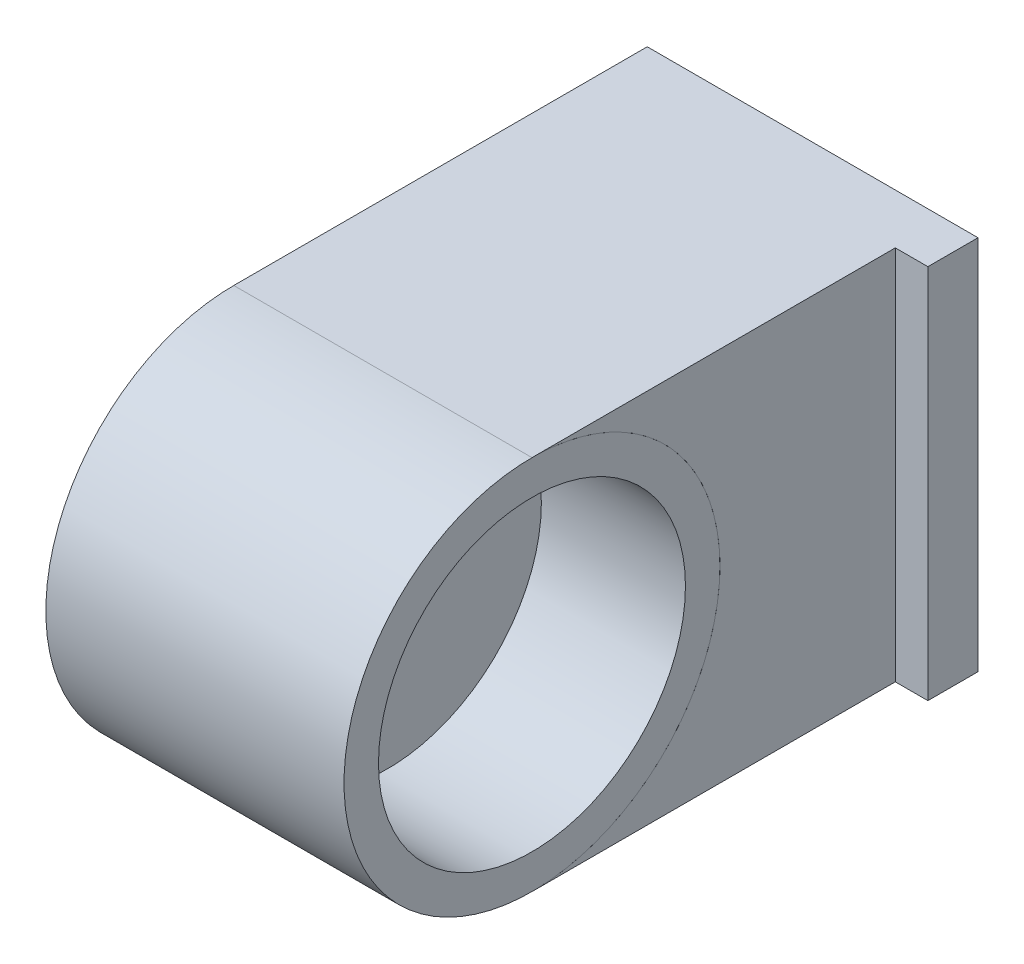
ISO-10303-21;
HEADER;
FILE_DESCRIPTION(('STEP AP214'),'2;1');
FILE_NAME('part.step','',(''),(''),'','','');
FILE_SCHEMA(('AUTOMOTIVE_DESIGN { 1 0 10303 214 1 1 1 1 }'));
ENDSEC;
DATA;
#1=APPLICATION_CONTEXT('core data for automotive mechanical design processes');
#2=APPLICATION_PROTOCOL_DEFINITION('international standard','automotive_design',2000,#1);
#3=PRODUCT_CONTEXT('',#1,'mechanical');
#4=PRODUCT('Part','Part','',(#3));
#5=PRODUCT_RELATED_PRODUCT_CATEGORY('part','',(#4));
#6=PRODUCT_DEFINITION_FORMATION('','',#4);
#7=PRODUCT_DEFINITION_CONTEXT('part definition',#1,'design');
#8=PRODUCT_DEFINITION('design','',#6,#7);
#9=PRODUCT_DEFINITION_SHAPE('','',#8);
#10=(LENGTH_UNIT() NAMED_UNIT(*) SI_UNIT(.MILLI.,.METRE.));
#11=(NAMED_UNIT(*) PLANE_ANGLE_UNIT() SI_UNIT($,.RADIAN.));
#12=(NAMED_UNIT(*) SI_UNIT($,.STERADIAN.) SOLID_ANGLE_UNIT());
#13=UNCERTAINTY_MEASURE_WITH_UNIT(LENGTH_MEASURE(1.E-05),#10,'distance_accuracy_value','');
#14=(GEOMETRIC_REPRESENTATION_CONTEXT(3) GLOBAL_UNCERTAINTY_ASSIGNED_CONTEXT((#13)) GLOBAL_UNIT_ASSIGNED_CONTEXT((#10,
#11,#12)) REPRESENTATION_CONTEXT('',''));
#15=CARTESIAN_POINT('',(0.,0.,0.));
#16=DIRECTION('',(0.,0.,1.));
#17=DIRECTION('',(1.,0.,0.));
#18=AXIS2_PLACEMENT_3D('',#15,#16,#17);
#19=CARTESIAN_POINT('',(0.,0.,-30.));
#20=DIRECTION('',(0.,0.,-1.));
#21=DIRECTION('',(-1.,0.,0.));
#22=AXIS2_PLACEMENT_3D('',#19,#20,#21);
#23=PLANE('',#22);
#24=DIRECTION('',(1.,0.,0.));
#25=VECTOR('',#24,1.);
#26=CARTESIAN_POINT('',(0.,6.5,-30.));
#27=LINE('',#26,#25);
#28=CARTESIAN_POINT('',(0.,6.5,-30.));
#29=VERTEX_POINT('',#28);
#30=CARTESIAN_POINT('',(23.4,6.5,-30.));
#31=VERTEX_POINT('',#30);
#32=EDGE_CURVE('E12',#29,#31,#27,.T.);
#33=ORIENTED_EDGE('',*,*,#32,.T.);
#34=CARTESIAN_POINT('',(24.4,6.5,-30.));
#35=DIRECTION('',(0.,0.,-1.));
#36=DIRECTION('',(-1.,0.,0.));
#37=AXIS2_PLACEMENT_3D('',#34,#35,#36);
#38=CIRCLE('',#37,1.);
#39=CARTESIAN_POINT('',(24.4,5.5,-30.));
#40=VERTEX_POINT('',#39);
#41=EDGE_CURVE('E187',#40,#31,#38,.F.);
#42=ORIENTED_EDGE('',*,*,#41,.F.);
#43=DIRECTION('',(0.,1.,0.));
#44=VECTOR('',#43,1.);
#45=CARTESIAN_POINT('',(24.4,6.5,-30.));
#46=LINE('',#45,#44);
#47=CARTESIAN_POINT('',(24.4,-15.,-30.));
#48=VERTEX_POINT('',#47);
#49=EDGE_CURVE('E163',#48,#40,#46,.T.);
#50=ORIENTED_EDGE('',*,*,#49,.F.);
#51=DIRECTION('',(-1.,0.,0.));
#52=VECTOR('',#51,1.);
#53=CARTESIAN_POINT('',(23.8,-15.,-30.));
#54=LINE('',#53,#52);
#55=CARTESIAN_POINT('',(0.,-15.,-30.));
#56=VERTEX_POINT('',#55);
#57=EDGE_CURVE('E75',#48,#56,#54,.T.);
#58=ORIENTED_EDGE('',*,*,#57,.T.);
#59=DIRECTION('',(0.,1.,0.));
#60=VECTOR('',#59,1.);
#61=CARTESIAN_POINT('',(0.,-15.,-30.));
#62=LINE('',#61,#60);
#63=EDGE_CURVE('E145',#56,#29,#62,.T.);
#64=ORIENTED_EDGE('',*,*,#63,.T.);
#65=EDGE_LOOP('',(#33,#42,#50,#58,#64));
#66=FACE_BOUND('',#65,.T.);
#67=CARTESIAN_POINT('',(11.9,-6.,-30.));
#68=DIRECTION('',(0.,0.,-1.));
#69=DIRECTION('',(-1.,0.,0.));
#70=AXIS2_PLACEMENT_3D('',#67,#68,#69);
#71=CIRCLE('',#70,1.64999999999999);
#72=CARTESIAN_POINT('',(10.25,-6.,-30.));
#73=VERTEX_POINT('',#72);
#74=EDGE_CURVE('E176',#73,#73,#71,.T.);
#75=ORIENTED_EDGE('',*,*,#74,.F.);
#76=EDGE_LOOP('',(#75));
#77=FACE_BOUND('',#76,.T.);
#78=ADVANCED_FACE('F52',(#66,#77),#23,.T.);
#79=CARTESIAN_POINT('',(23.8,15.,-30.));
#80=DIRECTION('',(0.,-1.,0.));
#81=DIRECTION('',(0.,0.,-1.));
#82=AXIS2_PLACEMENT_3D('',#79,#80,#81);
#83=PLANE('',#82);
#84=DIRECTION('',(0.,0.,1.));
#85=VECTOR('',#84,1.);
#86=CARTESIAN_POINT('',(23.8,15.,-30.));
#87=LINE('',#86,#85);
#88=CARTESIAN_POINT('',(23.8,15.,-29.));
#89=VERTEX_POINT('',#88);
#90=CARTESIAN_POINT('',(23.8,15.,0.));
#91=VERTEX_POINT('',#90);
#92=EDGE_CURVE('E60',#89,#91,#87,.T.);
#93=ORIENTED_EDGE('',*,*,#92,.F.);
#94=DIRECTION('',(1.,0.,0.));
#95=VECTOR('',#94,1.);
#96=CARTESIAN_POINT('',(0.,15.,-29.));
#97=LINE('',#96,#95);
#98=CARTESIAN_POINT('',(26.4,15.,-29.));
#99=VERTEX_POINT('',#98);
#100=EDGE_CURVE('E167',#89,#99,#97,.T.);
#101=ORIENTED_EDGE('',*,*,#100,.T.);
#102=DIRECTION('',(0.,0.,1.));
#103=VECTOR('',#102,1.);
#104=CARTESIAN_POINT('',(26.4,15.,-60.1884166512138));
#105=LINE('',#104,#103);
#106=CARTESIAN_POINT('',(26.4,15.,-33.));
#107=VERTEX_POINT('',#106);
#108=EDGE_CURVE('E162',#107,#99,#105,.T.);
#109=ORIENTED_EDGE('',*,*,#108,.F.);
#110=DIRECTION('',(1.,0.,0.));
#111=VECTOR('',#110,1.);
#112=CARTESIAN_POINT('',(0.,15.,-33.));
#113=LINE('',#112,#111);
#114=CARTESIAN_POINT('',(0.,15.,-33.));
#115=VERTEX_POINT('',#114);
#116=EDGE_CURVE('E152',#115,#107,#113,.T.);
#117=ORIENTED_EDGE('',*,*,#116,.F.);
#118=DIRECTION('',(0.,0.,1.));
#119=VECTOR('',#118,1.);
#120=CARTESIAN_POINT('',(0.,15.,-30.));
#121=LINE('',#120,#119);
#122=CARTESIAN_POINT('',(0.,15.,0.));
#123=VERTEX_POINT('',#122);
#124=EDGE_CURVE('E132',#115,#123,#121,.T.);
#125=ORIENTED_EDGE('',*,*,#124,.T.);
#126=DIRECTION('',(-1.,0.,0.));
#127=VECTOR('',#126,1.);
#128=CARTESIAN_POINT('',(4.,15.,0.));
#129=LINE('',#128,#127);
#130=EDGE_CURVE('E214',#123,#91,#129,.F.);
#131=ORIENTED_EDGE('',*,*,#130,.T.);
#132=EDGE_LOOP('',(#93,#101,#109,#117,#125,#131));
#133=FACE_BOUND('',#132,.T.);
#134=ADVANCED_FACE('F54',(#133),#83,.F.);
#135=CARTESIAN_POINT('',(23.8,15.,-30.));
#136=DIRECTION('',(-1.,0.,0.));
#137=DIRECTION('',(0.,0.,1.));
#138=AXIS2_PLACEMENT_3D('',#135,#136,#137);
#139=PLANE('',#138);
#140=DIRECTION('',(0.,-1.,0.));
#141=VECTOR('',#140,1.);
#142=CARTESIAN_POINT('',(23.8,15.,-29.));
#143=LINE('',#142,#141);
#144=CARTESIAN_POINT('',(23.8,-15.,-29.));
#145=VERTEX_POINT('',#144);
#146=EDGE_CURVE('E67',#89,#145,#143,.T.);
#147=ORIENTED_EDGE('',*,*,#146,.F.);
#148=ORIENTED_EDGE('',*,*,#92,.T.);
#149=CARTESIAN_POINT('',(23.8,0.,0.));
#150=DIRECTION('',(1.,0.,0.));
#151=DIRECTION('',(0.,0.,-1.));
#152=AXIS2_PLACEMENT_3D('',#149,#150,#151);
#153=CIRCLE('',#152,15.);
#154=CARTESIAN_POINT('',(23.8,-15.,0.));
#155=VERTEX_POINT('',#154);
#156=EDGE_CURVE('E216',#91,#155,#153,.F.);
#157=ORIENTED_EDGE('',*,*,#156,.T.);
#158=DIRECTION('',(0.,0.,1.));
#159=VECTOR('',#158,1.);
#160=CARTESIAN_POINT('',(23.8,-15.,-30.));
#161=LINE('',#160,#159);
#162=EDGE_CURVE('E224',#145,#155,#161,.T.);
#163=ORIENTED_EDGE('',*,*,#162,.F.);
#164=EDGE_LOOP('',(#147,#148,#157,#163));
#165=FACE_BOUND('',#164,.T.);
#166=ADVANCED_FACE('F227',(#165),#139,.F.);
#167=CARTESIAN_POINT('',(23.8,-15.,-30.));
#168=DIRECTION('',(0.,1.,0.));
#169=DIRECTION('',(0.,0.,1.));
#170=AXIS2_PLACEMENT_3D('',#167,#168,#169);
#171=PLANE('',#170);
#172=ORIENTED_EDGE('',*,*,#57,.F.);
#173=DIRECTION('',(0.,0.,1.));
#174=VECTOR('',#173,1.);
#175=CARTESIAN_POINT('',(24.4,-15.,-33.));
#176=LINE('',#175,#174);
#177=CARTESIAN_POINT('',(24.4,-15.,-33.));
#178=VERTEX_POINT('',#177);
#179=EDGE_CURVE('E177',#178,#48,#176,.T.);
#180=ORIENTED_EDGE('',*,*,#179,.F.);
#181=DIRECTION('',(-1.,0.,0.));
#182=VECTOR('',#181,1.);
#183=CARTESIAN_POINT('',(24.4,-15.,-33.));
#184=LINE('',#183,#182);
#185=CARTESIAN_POINT('',(26.4,-15.,-33.));
#186=VERTEX_POINT('',#185);
#187=EDGE_CURVE('E156',#186,#178,#184,.T.);
#188=ORIENTED_EDGE('',*,*,#187,.F.);
#189=DIRECTION('',(0.,0.,1.));
#190=VECTOR('',#189,1.);
#191=CARTESIAN_POINT('',(26.4,-15.,-33.));
#192=LINE('',#191,#190);
#193=CARTESIAN_POINT('',(26.4,-15.,-29.));
#194=VERTEX_POINT('',#193);
#195=EDGE_CURVE('E155',#186,#194,#192,.T.);
#196=ORIENTED_EDGE('',*,*,#195,.T.);
#197=DIRECTION('',(-1.,0.,0.));
#198=VECTOR('',#197,1.);
#199=CARTESIAN_POINT('',(24.4,-15.,-29.));
#200=LINE('',#199,#198);
#201=EDGE_CURVE('E165',#194,#145,#200,.T.);
#202=ORIENTED_EDGE('',*,*,#201,.T.);
#203=ORIENTED_EDGE('',*,*,#162,.T.);
#204=DIRECTION('',(-1.,0.,0.));
#205=VECTOR('',#204,1.);
#206=CARTESIAN_POINT('',(4.,-15.,0.));
#207=LINE('',#206,#205);
#208=CARTESIAN_POINT('',(0.,-15.,0.));
#209=VERTEX_POINT('',#208);
#210=EDGE_CURVE('E209',#209,#155,#207,.F.);
#211=ORIENTED_EDGE('',*,*,#210,.F.);
#212=DIRECTION('',(0.,0.,1.));
#213=VECTOR('',#212,1.);
#214=CARTESIAN_POINT('',(0.,-15.,-30.));
#215=LINE('',#214,#213);
#216=EDGE_CURVE('E144',#56,#209,#215,.T.);
#217=ORIENTED_EDGE('',*,*,#216,.F.);
#218=EDGE_LOOP('',(#172,#180,#188,#196,#202,#203,#211,#217));
#219=FACE_BOUND('',#218,.T.);
#220=ADVANCED_FACE('F232',(#219),#171,.F.);
#221=CARTESIAN_POINT('',(0.,-15.,-30.));
#222=DIRECTION('',(1.,0.,0.));
#223=DIRECTION('',(0.,0.,-1.));
#224=AXIS2_PLACEMENT_3D('',#221,#222,#223);
#225=PLANE('',#224);
#226=ORIENTED_EDGE('',*,*,#124,.F.);
#227=DIRECTION('',(0.,1.,0.));
#228=VECTOR('',#227,1.);
#229=CARTESIAN_POINT('',(0.,6.5,-33.));
#230=LINE('',#229,#228);
#231=CARTESIAN_POINT('',(0.,6.5,-33.));
#232=VERTEX_POINT('',#231);
#233=EDGE_CURVE('E136',#232,#115,#230,.T.);
#234=ORIENTED_EDGE('',*,*,#233,.F.);
#235=DIRECTION('',(0.,0.,1.));
#236=VECTOR('',#235,1.);
#237=CARTESIAN_POINT('',(0.,6.5,-33.));
#238=LINE('',#237,#236);
#239=EDGE_CURVE('E174',#232,#29,#238,.T.);
#240=ORIENTED_EDGE('',*,*,#239,.T.);
#241=ORIENTED_EDGE('',*,*,#63,.F.);
#242=ORIENTED_EDGE('',*,*,#216,.T.);
#243=CARTESIAN_POINT('',(0.,0.,0.));
#244=DIRECTION('',(-1.,0.,0.));
#245=DIRECTION('',(0.,0.,1.));
#246=AXIS2_PLACEMENT_3D('',#243,#244,#245);
#247=CIRCLE('',#246,15.);
#248=EDGE_CURVE('E139',#209,#123,#247,.F.);
#249=ORIENTED_EDGE('',*,*,#248,.T.);
#250=EDGE_LOOP('',(#226,#234,#240,#241,#242,#249));
#251=FACE_BOUND('',#250,.T.);
#252=CARTESIAN_POINT('',(0.,0.,-20.));
#253=DIRECTION('',(-1.,0.,0.));
#254=DIRECTION('',(0.,0.,1.));
#255=AXIS2_PLACEMENT_3D('',#252,#253,#254);
#256=CIRCLE('',#255,2.);
#257=CARTESIAN_POINT('',(0.,0.,-18.));
#258=VERTEX_POINT('',#257);
#259=EDGE_CURVE('E205',#258,#258,#256,.T.);
#260=ORIENTED_EDGE('',*,*,#259,.F.);
#261=EDGE_LOOP('',(#260));
#262=FACE_BOUND('',#261,.T.);
#263=ADVANCED_FACE('F134',(#251,#262),#225,.F.);
#264=CARTESIAN_POINT('',(4.,0.,0.));
#265=DIRECTION('',(-1.,0.,0.));
#266=DIRECTION('',(0.,0.,1.));
#267=AXIS2_PLACEMENT_3D('',#264,#265,#266);
#268=CYLINDRICAL_SURFACE('',#267,15.);
#269=ORIENTED_EDGE('',*,*,#248,.F.);
#270=ORIENTED_EDGE('',*,*,#210,.T.);
#271=ORIENTED_EDGE('',*,*,#156,.F.);
#272=ORIENTED_EDGE('',*,*,#130,.F.);
#273=EDGE_LOOP('',(#269,#270,#271,#272));
#274=FACE_BOUND('',#273,.T.);
#275=ADVANCED_FACE('F230',(#274),#268,.F.);
#276=CARTESIAN_POINT('',(1.,0.,-20.));
#277=DIRECTION('',(-1.,0.,0.));
#278=DIRECTION('',(0.,0.,1.));
#279=AXIS2_PLACEMENT_3D('',#276,#277,#278);
#280=CYLINDRICAL_SURFACE('',#279,2.);
#281=CARTESIAN_POINT('',(1.,0.,-20.));
#282=DIRECTION('',(-1.,0.,0.));
#283=DIRECTION('',(0.,0.,1.));
#284=AXIS2_PLACEMENT_3D('',#281,#282,#283);
#285=CIRCLE('',#284,2.);
#286=CARTESIAN_POINT('',(1.,0.,-18.));
#287=VERTEX_POINT('',#286);
#288=EDGE_CURVE('E206',#287,#287,#285,.T.);
#289=ORIENTED_EDGE('',*,*,#288,.F.);
#290=EDGE_LOOP('',(#289));
#291=FACE_BOUND('',#290,.T.);
#292=ORIENTED_EDGE('',*,*,#259,.T.);
#293=EDGE_LOOP('',(#292));
#294=FACE_BOUND('',#293,.T.);
#295=ADVANCED_FACE('F295',(#291,#294),#280,.F.);
#296=CARTESIAN_POINT('',(1.,0.,-20.));
#297=DIRECTION('',(-1.,0.,0.));
#298=DIRECTION('',(0.,0.,1.));
#299=AXIS2_PLACEMENT_3D('',#296,#297,#298);
#300=PLANE('',#299);
#301=ORIENTED_EDGE('',*,*,#288,.T.);
#302=EDGE_LOOP('',(#301));
#303=FACE_BOUND('',#302,.T.);
#304=ADVANCED_FACE('F259',(#303),#300,.T.);
#305=CARTESIAN_POINT('',(0.,0.,-29.));
#306=DIRECTION('',(0.,0.,-1.));
#307=DIRECTION('',(-1.,0.,0.));
#308=AXIS2_PLACEMENT_3D('',#305,#306,#307);
#309=PLANE('',#308);
#310=ORIENTED_EDGE('',*,*,#146,.T.);
#311=ORIENTED_EDGE('',*,*,#201,.F.);
#312=DIRECTION('',(0.,-1.,0.));
#313=VECTOR('',#312,1.);
#314=CARTESIAN_POINT('',(26.4,8.5,-29.));
#315=LINE('',#314,#313);
#316=EDGE_CURVE('E201',#99,#194,#315,.T.);
#317=ORIENTED_EDGE('',*,*,#316,.F.);
#318=ORIENTED_EDGE('',*,*,#100,.F.);
#319=EDGE_LOOP('',(#310,#311,#317,#318));
#320=FACE_BOUND('',#319,.T.);
#321=ADVANCED_FACE('F235',(#320),#309,.F.);
#322=CARTESIAN_POINT('',(24.4,6.5,-29.));
#323=DIRECTION('',(0.,1.,0.));
#324=DIRECTION('',(0.,0.,1.));
#325=AXIS2_PLACEMENT_3D('',#322,#323,#324);
#326=PLANE('',#325);
#327=ORIENTED_EDGE('',*,*,#32,.F.);
#328=ORIENTED_EDGE('',*,*,#239,.F.);
#329=DIRECTION('',(1.,0.,0.));
#330=VECTOR('',#329,1.);
#331=CARTESIAN_POINT('',(24.4,6.5,-33.));
#332=LINE('',#331,#330);
#333=CARTESIAN_POINT('',(23.4,6.5,-33.));
#334=VERTEX_POINT('',#333);
#335=EDGE_CURVE('E154',#232,#334,#332,.T.);
#336=ORIENTED_EDGE('',*,*,#335,.T.);
#337=DIRECTION('',(0.,0.,-1.));
#338=VECTOR('',#337,1.);
#339=CARTESIAN_POINT('',(23.4,6.5,-27.1715728752538));
#340=LINE('',#339,#338);
#341=EDGE_CURVE('E192',#334,#31,#340,.F.);
#342=ORIENTED_EDGE('',*,*,#341,.T.);
#343=EDGE_LOOP('',(#327,#328,#336,#342));
#344=FACE_BOUND('',#343,.T.);
#345=ADVANCED_FACE('F251',(#344),#326,.F.);
#346=CARTESIAN_POINT('',(26.4,8.5,-29.));
#347=DIRECTION('',(1.,0.,0.));
#348=DIRECTION('',(0.,1.,0.));
#349=AXIS2_PLACEMENT_3D('',#346,#347,#348);
#350=PLANE('',#349);
#351=DIRECTION('',(0.,-1.,0.));
#352=VECTOR('',#351,1.);
#353=CARTESIAN_POINT('',(26.4,8.5,-33.));
#354=LINE('',#353,#352);
#355=EDGE_CURVE('E199',#107,#186,#354,.T.);
#356=ORIENTED_EDGE('',*,*,#355,.F.);
#357=ORIENTED_EDGE('',*,*,#108,.T.);
#358=ORIENTED_EDGE('',*,*,#316,.T.);
#359=ORIENTED_EDGE('',*,*,#195,.F.);
#360=EDGE_LOOP('',(#356,#357,#358,#359));
#361=FACE_BOUND('',#360,.T.);
#362=ADVANCED_FACE('F237',(#361),#350,.T.);
#363=CARTESIAN_POINT('',(24.4,6.5,-29.));
#364=DIRECTION('',(1.,0.,0.));
#365=DIRECTION('',(0.,0.,-1.));
#366=AXIS2_PLACEMENT_3D('',#363,#364,#365);
#367=PLANE('',#366);
#368=ORIENTED_EDGE('',*,*,#179,.T.);
#369=ORIENTED_EDGE('',*,*,#49,.T.);
#370=DIRECTION('',(0.,0.,-1.));
#371=VECTOR('',#370,1.);
#372=CARTESIAN_POINT('',(24.4,5.5,-27.1715728752538));
#373=LINE('',#372,#371);
#374=CARTESIAN_POINT('',(24.4,5.5,-33.));
#375=VERTEX_POINT('',#374);
#376=EDGE_CURVE('E189',#40,#375,#373,.T.);
#377=ORIENTED_EDGE('',*,*,#376,.T.);
#378=DIRECTION('',(0.,-1.,0.));
#379=VECTOR('',#378,1.);
#380=CARTESIAN_POINT('',(24.4,6.5,-33.));
#381=LINE('',#380,#379);
#382=EDGE_CURVE('E196',#375,#178,#381,.T.);
#383=ORIENTED_EDGE('',*,*,#382,.T.);
#384=EDGE_LOOP('',(#368,#369,#377,#383));
#385=FACE_BOUND('',#384,.T.);
#386=ADVANCED_FACE('F240',(#385),#367,.F.);
#387=CARTESIAN_POINT('',(0.,0.,-33.));
#388=DIRECTION('',(0.,0.,-1.));
#389=DIRECTION('',(-1.,0.,0.));
#390=AXIS2_PLACEMENT_3D('',#387,#388,#389);
#391=PLANE('',#390);
#392=ORIENTED_EDGE('',*,*,#233,.T.);
#393=ORIENTED_EDGE('',*,*,#116,.T.);
#394=ORIENTED_EDGE('',*,*,#355,.T.);
#395=ORIENTED_EDGE('',*,*,#187,.T.);
#396=ORIENTED_EDGE('',*,*,#382,.F.);
#397=CARTESIAN_POINT('',(24.4,6.5,-33.));
#398=DIRECTION('',(0.,0.,-1.));
#399=DIRECTION('',(-1.,0.,0.));
#400=AXIS2_PLACEMENT_3D('',#397,#398,#399);
#401=CIRCLE('',#400,1.);
#402=EDGE_CURVE('E185',#334,#375,#401,.T.);
#403=ORIENTED_EDGE('',*,*,#402,.F.);
#404=ORIENTED_EDGE('',*,*,#335,.F.);
#405=EDGE_LOOP('',(#392,#393,#394,#395,#396,#403,#404));
#406=FACE_BOUND('',#405,.T.);
#407=ADVANCED_FACE('F150',(#406),#391,.T.);
#408=CARTESIAN_POINT('',(24.4,6.5,-27.1715728752538));
#409=DIRECTION('',(0.,0.,-1.));
#410=DIRECTION('',(-1.,0.,0.));
#411=AXIS2_PLACEMENT_3D('',#408,#409,#410);
#412=CYLINDRICAL_SURFACE('',#411,1.);
#413=ORIENTED_EDGE('',*,*,#402,.T.);
#414=ORIENTED_EDGE('',*,*,#376,.F.);
#415=ORIENTED_EDGE('',*,*,#41,.T.);
#416=ORIENTED_EDGE('',*,*,#341,.F.);
#417=EDGE_LOOP('',(#413,#414,#415,#416));
#418=FACE_BOUND('',#417,.T.);
#419=ADVANCED_FACE('F245',(#418),#412,.F.);
#420=CARTESIAN_POINT('',(11.9,-6.,-19.9));
#421=DIRECTION('',(0.,0.,-1.));
#422=DIRECTION('',(-1.,0.,0.));
#423=AXIS2_PLACEMENT_3D('',#420,#421,#422);
#424=CONICAL_SURFACE('',#423,1.64999999999999,1.02974425867665);
#425=CARTESIAN_POINT('',(11.9,-6.,-18.9085799786045));
#426=VERTEX_POINT('',#425);
#427=VERTEX_LOOP('',#426);
#428=FACE_BOUND('',#427,.T.);
#429=CARTESIAN_POINT('',(11.9,-6.,-19.9));
#430=DIRECTION('',(0.,0.,-1.));
#431=DIRECTION('',(-1.,0.,0.));
#432=AXIS2_PLACEMENT_3D('',#429,#430,#431);
#433=CIRCLE('',#432,1.64999999999999);
#434=CARTESIAN_POINT('',(10.25,-6.,-19.9));
#435=VERTEX_POINT('',#434);
#436=EDGE_CURVE('E182',#435,#435,#433,.T.);
#437=ORIENTED_EDGE('',*,*,#436,.T.);
#438=EDGE_LOOP('',(#437));
#439=FACE_BOUND('',#438,.T.);
#440=ADVANCED_FACE('F339',(#428,#439),#424,.F.);
#441=CARTESIAN_POINT('',(11.9,-6.,-30.));
#442=DIRECTION('',(0.,0.,-1.));
#443=DIRECTION('',(-1.,0.,0.));
#444=AXIS2_PLACEMENT_3D('',#441,#442,#443);
#445=CYLINDRICAL_SURFACE('',#444,1.64999999999999);
#446=ORIENTED_EDGE('',*,*,#436,.F.);
#447=EDGE_LOOP('',(#446));
#448=FACE_BOUND('',#447,.T.);
#449=ORIENTED_EDGE('',*,*,#74,.T.);
#450=EDGE_LOOP('',(#449));
#451=FACE_BOUND('',#450,.T.);
#452=ADVANCED_FACE('F345',(#448,#451),#445,.F.);
#453=CLOSED_SHELL('',(#78,#134,#166,#220,#263,#275,#295,#304,#321,#345,#362,#386,#407,#419,#440,#452));
#454=MANIFOLD_SOLID_BREP('B2',#453);
#455=CARTESIAN_POINT('',(11.5,0.,0.));
#456=DIRECTION('',(1.,0.,0.));
#457=DIRECTION('',(0.,0.,-1.));
#458=AXIS2_PLACEMENT_3D('',#455,#456,#457);
#459=PLANE('',#458);
#460=CARTESIAN_POINT('',(11.5,0.,0.));
#461=DIRECTION('',(1.,0.,0.));
#462=DIRECTION('',(0.,0.,-1.));
#463=AXIS2_PLACEMENT_3D('',#460,#461,#462);
#464=CIRCLE('',#463,0.5);
#465=CARTESIAN_POINT('',(11.5,0.,-0.5));
#466=VERTEX_POINT('',#465);
#467=EDGE_CURVE('E689',#466,#466,#464,.T.);
#468=ORIENTED_EDGE('',*,*,#467,.T.);
#469=EDGE_LOOP('',(#468));
#470=FACE_BOUND('',#469,.T.);
#471=CARTESIAN_POINT('',(11.5,0.,0.));
#472=DIRECTION('',(1.,0.,0.));
#473=DIRECTION('',(0.,0.,-1.));
#474=AXIS2_PLACEMENT_3D('',#471,#472,#473);
#475=CIRCLE('',#474,12.25);
#476=CARTESIAN_POINT('',(11.5,0.,-12.25));
#477=VERTEX_POINT('',#476);
#478=EDGE_CURVE('E701',#477,#477,#475,.T.);
#479=ORIENTED_EDGE('',*,*,#478,.F.);
#480=EDGE_LOOP('',(#479));
#481=FACE_BOUND('',#480,.T.);
#482=CARTESIAN_POINT('',(11.5,0.,0.));
#483=DIRECTION('',(1.,0.,0.));
#484=DIRECTION('',(0.,0.,1.));
#485=AXIS2_PLACEMENT_3D('',#482,#483,#484);
#486=CIRCLE('',#485,1.);
#487=CARTESIAN_POINT('',(11.5,0.968245836551854,-0.250000000000011));
#488=VERTEX_POINT('',#487);
#489=CARTESIAN_POINT('',(11.5,0.968245836551855,0.249999999999989));
#490=VERTEX_POINT('',#489);
#491=EDGE_CURVE('E672',#488,#490,#486,.T.);
#492=ORIENTED_EDGE('',*,*,#491,.F.);
#493=DIRECTION('',(0.,-1.,0.));
#494=VECTOR('',#493,1.);
#495=CARTESIAN_POINT('',(11.5,10.,-0.250000000000012));
#496=LINE('',#495,#494);
#497=CARTESIAN_POINT('',(11.5,10.,-0.250000000000012));
#498=VERTEX_POINT('',#497);
#499=EDGE_CURVE('E670',#498,#488,#496,.T.);
#500=ORIENTED_EDGE('',*,*,#499,.F.);
#501=DIRECTION('',(0.,0.,-1.));
#502=VECTOR('',#501,1.);
#503=CARTESIAN_POINT('',(11.5,10.,-0.250000000000012));
#504=LINE('',#503,#502);
#505=CARTESIAN_POINT('',(11.5,10.,0.249999999999988));
#506=VERTEX_POINT('',#505);
#507=EDGE_CURVE('E660',#506,#498,#504,.T.);
#508=ORIENTED_EDGE('',*,*,#507,.F.);
#509=DIRECTION('',(0.,1.,0.));
#510=VECTOR('',#509,1.);
#511=CARTESIAN_POINT('',(11.5,10.,0.249999999999988));
#512=LINE('',#511,#510);
#513=EDGE_CURVE('E675',#490,#506,#512,.T.);
#514=ORIENTED_EDGE('',*,*,#513,.F.);
#515=EDGE_LOOP('',(#492,#500,#508,#514));
#516=FACE_BOUND('',#515,.T.);
#517=CARTESIAN_POINT('',(11.5,0.,0.));
#518=DIRECTION('',(1.,0.,0.));
#519=DIRECTION('',(0.,0.,1.));
#520=AXIS2_PLACEMENT_3D('',#517,#518,#519);
#521=CIRCLE('',#520,1.);
#522=CARTESIAN_POINT('',(11.5,-0.968245836551854,0.249999999999989));
#523=VERTEX_POINT('',#522);
#524=CARTESIAN_POINT('',(11.5,-0.968245836551854,-0.250000000000011));
#525=VERTEX_POINT('',#524);
#526=EDGE_CURVE('E640',#523,#525,#521,.T.);
#527=ORIENTED_EDGE('',*,*,#526,.F.);
#528=DIRECTION('',(0.,1.,0.));
#529=VECTOR('',#528,1.);
#530=CARTESIAN_POINT('',(11.5,-0.968245836551854,0.249999999999989));
#531=LINE('',#530,#529);
#532=CARTESIAN_POINT('',(11.5,-10.,0.24999999999999));
#533=VERTEX_POINT('',#532);
#534=EDGE_CURVE('E638',#533,#523,#531,.T.);
#535=ORIENTED_EDGE('',*,*,#534,.F.);
#536=DIRECTION('',(0.,0.,1.));
#537=VECTOR('',#536,1.);
#538=CARTESIAN_POINT('',(11.5,-10.,-0.25000000000001));
#539=LINE('',#538,#537);
#540=CARTESIAN_POINT('',(11.5,-10.,-0.25000000000001));
#541=VERTEX_POINT('',#540);
#542=EDGE_CURVE('E628',#541,#533,#539,.T.);
#543=ORIENTED_EDGE('',*,*,#542,.F.);
#544=DIRECTION('',(0.,-1.,0.));
#545=VECTOR('',#544,1.);
#546=CARTESIAN_POINT('',(11.5,-0.968245836551854,-0.250000000000011));
#547=LINE('',#546,#545);
#548=EDGE_CURVE('E644',#525,#541,#547,.T.);
#549=ORIENTED_EDGE('',*,*,#548,.F.);
#550=EDGE_LOOP('',(#527,#535,#543,#549));
#551=FACE_BOUND('',#550,.T.);
#552=DIRECTION('',(0.,0.,1.));
#553=VECTOR('',#552,1.);
#554=CARTESIAN_POINT('',(11.5,-0.25,-10.));
#555=LINE('',#554,#553);
#556=CARTESIAN_POINT('',(11.5,-0.25,-10.));
#557=VERTEX_POINT('',#556);
#558=CARTESIAN_POINT('',(11.5,-0.249999999999999,-0.968245836551865));
#559=VERTEX_POINT('',#558);
#560=EDGE_CURVE('E609',#557,#559,#555,.T.);
#561=ORIENTED_EDGE('',*,*,#560,.F.);
#562=DIRECTION('',(0.,-1.,0.));
#563=VECTOR('',#562,1.);
#564=CARTESIAN_POINT('',(11.5,0.25,-10.));
#565=LINE('',#564,#563);
#566=CARTESIAN_POINT('',(11.5,0.25,-10.));
#567=VERTEX_POINT('',#566);
#568=EDGE_CURVE('E464',#567,#557,#565,.T.);
#569=ORIENTED_EDGE('',*,*,#568,.F.);
#570=DIRECTION('',(0.,0.,-1.));
#571=VECTOR('',#570,1.);
#572=CARTESIAN_POINT('',(11.5,0.25,-10.));
#573=LINE('',#572,#571);
#574=CARTESIAN_POINT('',(11.5,0.25,-0.968245836551865));
#575=VERTEX_POINT('',#574);
#576=EDGE_CURVE('E598',#575,#567,#573,.T.);
#577=ORIENTED_EDGE('',*,*,#576,.F.);
#578=CARTESIAN_POINT('',(11.5,0.,0.));
#579=DIRECTION('',(1.,0.,0.));
#580=DIRECTION('',(0.,0.,1.));
#581=AXIS2_PLACEMENT_3D('',#578,#579,#580);
#582=CIRCLE('',#581,1.);
#583=EDGE_CURVE('E613',#559,#575,#582,.T.);
#584=ORIENTED_EDGE('',*,*,#583,.F.);
#585=EDGE_LOOP('',(#561,#569,#577,#584));
#586=FACE_BOUND('',#585,.T.);
#587=DIRECTION('',(0.,1.,0.));
#588=VECTOR('',#587,1.);
#589=CARTESIAN_POINT('',(11.5,0.25,9.99999999999999));
#590=LINE('',#589,#588);
#591=CARTESIAN_POINT('',(11.5,-0.25,9.99999999999999));
#592=VERTEX_POINT('',#591);
#593=CARTESIAN_POINT('',(11.5,0.25,9.99999999999999));
#594=VERTEX_POINT('',#593);
#595=EDGE_CURVE('E583',#592,#594,#590,.T.);
#596=ORIENTED_EDGE('',*,*,#595,.F.);
#597=DIRECTION('',(0.,0.,1.));
#598=VECTOR('',#597,1.);
#599=CARTESIAN_POINT('',(11.5,-0.25,0.968245836551844));
#600=LINE('',#599,#598);
#601=CARTESIAN_POINT('',(11.5,-0.25,0.968245836551844));
#602=VERTEX_POINT('',#601);
#603=EDGE_CURVE('E456',#602,#592,#600,.T.);
#604=ORIENTED_EDGE('',*,*,#603,.F.);
#605=CARTESIAN_POINT('',(11.5,0.,0.));
#606=DIRECTION('',(1.,0.,0.));
#607=DIRECTION('',(0.,0.,1.));
#608=AXIS2_PLACEMENT_3D('',#605,#606,#607);
#609=CIRCLE('',#608,1.);
#610=CARTESIAN_POINT('',(11.5,0.25,0.968245836551844));
#611=VERTEX_POINT('',#610);
#612=EDGE_CURVE('E574',#611,#602,#609,.T.);
#613=ORIENTED_EDGE('',*,*,#612,.F.);
#614=DIRECTION('',(0.,0.,-1.));
#615=VECTOR('',#614,1.);
#616=CARTESIAN_POINT('',(11.5,0.25,0.968245836551844));
#617=LINE('',#616,#615);
#618=EDGE_CURVE('E577',#594,#611,#617,.T.);
#619=ORIENTED_EDGE('',*,*,#618,.F.);
#620=EDGE_LOOP('',(#596,#604,#613,#619));
#621=FACE_BOUND('',#620,.T.);
#622=ADVANCED_FACE('F441',(#470,#481,#516,#551,#586,#621),#459,.F.);
#623=CARTESIAN_POINT('',(0.,0.,0.));
#624=DIRECTION('',(1.,0.,0.));
#625=DIRECTION('',(0.,0.,-1.));
#626=AXIS2_PLACEMENT_3D('',#623,#624,#625);
#627=PLANE('',#626);
#628=CARTESIAN_POINT('',(0.,0.,0.));
#629=DIRECTION('',(1.,0.,0.));
#630=DIRECTION('',(0.,0.,-1.));
#631=AXIS2_PLACEMENT_3D('',#628,#629,#630);
#632=CIRCLE('',#631,15.);
#633=CARTESIAN_POINT('',(0.,0.,-15.));
#634=VERTEX_POINT('',#633);
#635=EDGE_CURVE('E50',#634,#634,#632,.T.);
#636=ORIENTED_EDGE('',*,*,#635,.F.);
#637=EDGE_LOOP('',(#636));
#638=FACE_BOUND('',#637,.T.);
#639=CARTESIAN_POINT('',(0.,0.,0.));
#640=DIRECTION('',(-1.,0.,0.));
#641=DIRECTION('',(0.,0.,1.));
#642=AXIS2_PLACEMENT_3D('',#639,#640,#641);
#643=CIRCLE('',#642,12.25);
#644=CARTESIAN_POINT('',(0.,0.,12.25));
#645=VERTEX_POINT('',#644);
#646=EDGE_CURVE('E449',#645,#645,#643,.T.);
#647=ORIENTED_EDGE('',*,*,#646,.F.);
#648=EDGE_LOOP('',(#647));
#649=FACE_BOUND('',#648,.T.);
#650=ADVANCED_FACE('F709',(#638,#649),#627,.F.);
#651=CARTESIAN_POINT('',(4.,0.,0.));
#652=DIRECTION('',(-1.,0.,0.));
#653=DIRECTION('',(0.,0.,1.));
#654=AXIS2_PLACEMENT_3D('',#651,#652,#653);
#655=CYLINDRICAL_SURFACE('',#654,15.);
#656=ORIENTED_EDGE('',*,*,#635,.T.);
#657=EDGE_LOOP('',(#656));
#658=FACE_BOUND('',#657,.T.);
#659=CARTESIAN_POINT('',(23.8,0.,0.));
#660=DIRECTION('',(1.,0.,0.));
#661=DIRECTION('',(0.,0.,-1.));
#662=AXIS2_PLACEMENT_3D('',#659,#660,#661);
#663=CIRCLE('',#662,15.);
#664=CARTESIAN_POINT('',(23.8,0.,-15.));
#665=VERTEX_POINT('',#664);
#666=EDGE_CURVE('E698',#665,#665,#663,.T.);
#667=ORIENTED_EDGE('',*,*,#666,.F.);
#668=EDGE_LOOP('',(#667));
#669=FACE_BOUND('',#668,.T.);
#670=ADVANCED_FACE('F443',(#658,#669),#655,.T.);
#671=CARTESIAN_POINT('',(0.,0.,0.));
#672=DIRECTION('',(-1.,0.,0.));
#673=DIRECTION('',(0.,0.,1.));
#674=AXIS2_PLACEMENT_3D('',#671,#672,#673);
#675=CYLINDRICAL_SURFACE('',#674,12.25);
#676=ORIENTED_EDGE('',*,*,#646,.T.);
#677=EDGE_LOOP('',(#676));
#678=FACE_BOUND('',#677,.T.);
#679=ORIENTED_EDGE('',*,*,#478,.T.);
#680=EDGE_LOOP('',(#679));
#681=FACE_BOUND('',#680,.T.);
#682=ADVANCED_FACE('F706',(#678,#681),#675,.F.);
#683=CARTESIAN_POINT('',(23.8,0.,0.));
#684=DIRECTION('',(-1.,0.,0.));
#685=DIRECTION('',(0.,0.,-1.));
#686=AXIS2_PLACEMENT_3D('',#683,#684,#685);
#687=PLANE('',#686);
#688=ORIENTED_EDGE('',*,*,#666,.T.);
#689=EDGE_LOOP('',(#688));
#690=FACE_BOUND('',#689,.T.);
#691=CARTESIAN_POINT('',(23.8,0.,0.));
#692=DIRECTION('',(-1.,0.,0.));
#693=DIRECTION('',(0.,0.,1.));
#694=AXIS2_PLACEMENT_3D('',#691,#692,#693);
#695=CIRCLE('',#694,12.25);
#696=CARTESIAN_POINT('',(23.8,0.,12.25));
#697=VERTEX_POINT('',#696);
#698=EDGE_CURVE('E695',#697,#697,#695,.T.);
#699=ORIENTED_EDGE('',*,*,#698,.T.);
#700=EDGE_LOOP('',(#699));
#701=FACE_BOUND('',#700,.T.);
#702=ADVANCED_FACE('F722',(#690,#701),#687,.F.);
#703=CARTESIAN_POINT('',(23.8,0.,0.));
#704=DIRECTION('',(1.,0.,0.));
#705=DIRECTION('',(0.,0.,1.));
#706=AXIS2_PLACEMENT_3D('',#703,#704,#705);
#707=CYLINDRICAL_SURFACE('',#706,12.25);
#708=ORIENTED_EDGE('',*,*,#698,.F.);
#709=EDGE_LOOP('',(#708));
#710=FACE_BOUND('',#709,.T.);
#711=CARTESIAN_POINT('',(12.3,0.,0.));
#712=DIRECTION('',(1.,0.,0.));
#713=DIRECTION('',(0.,0.,-1.));
#714=AXIS2_PLACEMENT_3D('',#711,#712,#713);
#715=CIRCLE('',#714,12.25);
#716=CARTESIAN_POINT('',(12.3,0.,-12.25));
#717=VERTEX_POINT('',#716);
#718=EDGE_CURVE('E692',#717,#717,#715,.T.);
#719=ORIENTED_EDGE('',*,*,#718,.F.);
#720=EDGE_LOOP('',(#719));
#721=FACE_BOUND('',#720,.T.);
#722=ADVANCED_FACE('F726',(#710,#721),#707,.F.);
#723=CARTESIAN_POINT('',(12.3,0.,0.));
#724=DIRECTION('',(-1.,0.,0.));
#725=DIRECTION('',(0.,0.,-1.));
#726=AXIS2_PLACEMENT_3D('',#723,#724,#725);
#727=PLANE('',#726);
#728=CARTESIAN_POINT('',(12.3,0.,0.));
#729=DIRECTION('',(1.,0.,0.));
#730=DIRECTION('',(0.,0.,-1.));
#731=AXIS2_PLACEMENT_3D('',#728,#729,#730);
#732=CIRCLE('',#731,0.5);
#733=CARTESIAN_POINT('',(12.3,0.,-0.5));
#734=VERTEX_POINT('',#733);
#735=EDGE_CURVE('E590',#734,#734,#732,.T.);
#736=ORIENTED_EDGE('',*,*,#735,.F.);
#737=EDGE_LOOP('',(#736));
#738=FACE_BOUND('',#737,.T.);
#739=ORIENTED_EDGE('',*,*,#718,.T.);
#740=EDGE_LOOP('',(#739));
#741=FACE_BOUND('',#740,.T.);
#742=ADVANCED_FACE('F730',(#738,#741),#727,.F.);
#743=CARTESIAN_POINT('',(0.,0.,0.));
#744=DIRECTION('',(1.,0.,0.));
#745=DIRECTION('',(0.,0.,-1.));
#746=AXIS2_PLACEMENT_3D('',#743,#744,#745);
#747=CYLINDRICAL_SURFACE('',#746,0.5);
#748=ORIENTED_EDGE('',*,*,#735,.T.);
#749=EDGE_LOOP('',(#748));
#750=FACE_BOUND('',#749,.T.);
#751=ORIENTED_EDGE('',*,*,#467,.F.);
#752=EDGE_LOOP('',(#751));
#753=FACE_BOUND('',#752,.T.);
#754=ADVANCED_FACE('F734',(#750,#753),#747,.F.);
#755=CARTESIAN_POINT('',(11.7,10.,-0.250000000000012));
#756=DIRECTION('',(0.,0.,-1.));
#757=DIRECTION('',(0.,1.,0.));
#758=AXIS2_PLACEMENT_3D('',#755,#756,#757);
#759=PLANE('',#758);
#760=ORIENTED_EDGE('',*,*,#499,.T.);
#761=DIRECTION('',(-1.,0.,0.));
#762=VECTOR('',#761,1.);
#763=CARTESIAN_POINT('',(11.7,0.968245836551854,-0.250000000000011));
#764=LINE('',#763,#762);
#765=CARTESIAN_POINT('',(11.7,0.968245836551854,-0.250000000000011));
#766=VERTEX_POINT('',#765);
#767=EDGE_CURVE('E669',#766,#488,#764,.T.);
#768=ORIENTED_EDGE('',*,*,#767,.F.);
#769=DIRECTION('',(0.,-1.,0.));
#770=VECTOR('',#769,1.);
#771=CARTESIAN_POINT('',(11.7,10.,-0.250000000000012));
#772=LINE('',#771,#770);
#773=CARTESIAN_POINT('',(11.7,10.,-0.250000000000012));
#774=VERTEX_POINT('',#773);
#775=EDGE_CURVE('E656',#774,#766,#772,.T.);
#776=ORIENTED_EDGE('',*,*,#775,.F.);
#777=DIRECTION('',(-1.,0.,0.));
#778=VECTOR('',#777,1.);
#779=CARTESIAN_POINT('',(11.7,10.,-0.250000000000012));
#780=LINE('',#779,#778);
#781=EDGE_CURVE('E641',#774,#498,#780,.T.);
#782=ORIENTED_EDGE('',*,*,#781,.T.);
#783=EDGE_LOOP('',(#760,#768,#776,#782));
#784=FACE_BOUND('',#783,.T.);
#785=ADVANCED_FACE('F738',(#784),#759,.F.);
#786=CARTESIAN_POINT('',(11.7,10.,-0.250000000000012));
#787=DIRECTION('',(0.,1.,0.));
#788=DIRECTION('',(0.,0.,1.));
#789=AXIS2_PLACEMENT_3D('',#786,#787,#788);
#790=PLANE('',#789);
#791=ORIENTED_EDGE('',*,*,#507,.T.);
#792=ORIENTED_EDGE('',*,*,#781,.F.);
#793=DIRECTION('',(0.,0.,-1.));
#794=VECTOR('',#793,1.);
#795=CARTESIAN_POINT('',(11.7,10.,-0.250000000000012));
#796=LINE('',#795,#794);
#797=CARTESIAN_POINT('',(11.7,10.,0.249999999999988));
#798=VERTEX_POINT('',#797);
#799=EDGE_CURVE('E666',#798,#774,#796,.T.);
#800=ORIENTED_EDGE('',*,*,#799,.F.);
#801=DIRECTION('',(-1.,0.,0.));
#802=VECTOR('',#801,1.);
#803=CARTESIAN_POINT('',(11.7,10.,0.249999999999988));
#804=LINE('',#803,#802);
#805=EDGE_CURVE('E681',#798,#506,#804,.T.);
#806=ORIENTED_EDGE('',*,*,#805,.T.);
#807=EDGE_LOOP('',(#791,#792,#800,#806));
#808=FACE_BOUND('',#807,.T.);
#809=ADVANCED_FACE('F742',(#808),#790,.F.);
#810=CARTESIAN_POINT('',(11.7,10.,0.249999999999988));
#811=DIRECTION('',(0.,0.,1.));
#812=DIRECTION('',(0.,-1.,0.));
#813=AXIS2_PLACEMENT_3D('',#810,#811,#812);
#814=PLANE('',#813);
#815=ORIENTED_EDGE('',*,*,#513,.T.);
#816=ORIENTED_EDGE('',*,*,#805,.F.);
#817=DIRECTION('',(0.,1.,0.));
#818=VECTOR('',#817,1.);
#819=CARTESIAN_POINT('',(11.7,10.,0.249999999999988));
#820=LINE('',#819,#818);
#821=CARTESIAN_POINT('',(11.7,0.968245836551855,0.249999999999989));
#822=VERTEX_POINT('',#821);
#823=EDGE_CURVE('E663',#822,#798,#820,.T.);
#824=ORIENTED_EDGE('',*,*,#823,.F.);
#825=DIRECTION('',(-1.,0.,0.));
#826=VECTOR('',#825,1.);
#827=CARTESIAN_POINT('',(11.7,0.968245836551855,0.249999999999989));
#828=LINE('',#827,#826);
#829=EDGE_CURVE('E683',#822,#490,#828,.T.);
#830=ORIENTED_EDGE('',*,*,#829,.T.);
#831=EDGE_LOOP('',(#815,#816,#824,#830));
#832=FACE_BOUND('',#831,.T.);
#833=ADVANCED_FACE('F748',(#832),#814,.F.);
#834=CARTESIAN_POINT('',(11.7,0.,0.));
#835=DIRECTION('',(-1.,0.,0.));
#836=DIRECTION('',(0.,0.,1.));
#837=AXIS2_PLACEMENT_3D('',#834,#835,#836);
#838=CYLINDRICAL_SURFACE('',#837,1.);
#839=ORIENTED_EDGE('',*,*,#491,.T.);
#840=ORIENTED_EDGE('',*,*,#829,.F.);
#841=CARTESIAN_POINT('',(11.7,0.,0.));
#842=DIRECTION('',(1.,0.,0.));
#843=DIRECTION('',(0.,0.,1.));
#844=AXIS2_PLACEMENT_3D('',#841,#842,#843);
#845=CIRCLE('',#844,1.);
#846=EDGE_CURVE('E659',#766,#822,#845,.T.);
#847=ORIENTED_EDGE('',*,*,#846,.F.);
#848=ORIENTED_EDGE('',*,*,#767,.T.);
#849=EDGE_LOOP('',(#839,#840,#847,#848));
#850=FACE_BOUND('',#849,.T.);
#851=ADVANCED_FACE('F744',(#850),#838,.T.);
#852=CARTESIAN_POINT('',(11.7,0.,0.));
#853=DIRECTION('',(-1.,0.,0.));
#854=DIRECTION('',(0.,0.,1.));
#855=AXIS2_PLACEMENT_3D('',#852,#853,#854);
#856=PLANE('',#855);
#857=ORIENTED_EDGE('',*,*,#775,.T.);
#858=ORIENTED_EDGE('',*,*,#846,.T.);
#859=ORIENTED_EDGE('',*,*,#823,.T.);
#860=ORIENTED_EDGE('',*,*,#799,.T.);
#861=EDGE_LOOP('',(#857,#858,#859,#860));
#862=FACE_BOUND('',#861,.T.);
#863=ADVANCED_FACE('F747',(#862),#856,.T.);
#864=CARTESIAN_POINT('',(11.7,-0.968245836551854,0.249999999999989));
#865=DIRECTION('',(0.,0.,1.));
#866=DIRECTION('',(0.,-1.,0.));
#867=AXIS2_PLACEMENT_3D('',#864,#865,#866);
#868=PLANE('',#867);
#869=ORIENTED_EDGE('',*,*,#534,.T.);
#870=DIRECTION('',(-1.,0.,0.));
#871=VECTOR('',#870,1.);
#872=CARTESIAN_POINT('',(11.7,-0.968245836551854,0.249999999999989));
#873=LINE('',#872,#871);
#874=CARTESIAN_POINT('',(11.7,-0.968245836551854,0.249999999999989));
#875=VERTEX_POINT('',#874);
#876=EDGE_CURVE('E637',#875,#523,#873,.T.);
#877=ORIENTED_EDGE('',*,*,#876,.F.);
#878=DIRECTION('',(0.,1.,0.));
#879=VECTOR('',#878,1.);
#880=CARTESIAN_POINT('',(11.7,-0.968245836551854,0.249999999999989));
#881=LINE('',#880,#879);
#882=CARTESIAN_POINT('',(11.7,-10.,0.24999999999999));
#883=VERTEX_POINT('',#882);
#884=EDGE_CURVE('E624',#883,#875,#881,.T.);
#885=ORIENTED_EDGE('',*,*,#884,.F.);
#886=DIRECTION('',(-1.,0.,0.));
#887=VECTOR('',#886,1.);
#888=CARTESIAN_POINT('',(11.7,-10.,0.24999999999999));
#889=LINE('',#888,#887);
#890=EDGE_CURVE('E610',#883,#533,#889,.T.);
#891=ORIENTED_EDGE('',*,*,#890,.T.);
#892=EDGE_LOOP('',(#869,#877,#885,#891));
#893=FACE_BOUND('',#892,.T.);
#894=ADVANCED_FACE('F758',(#893),#868,.F.);
#895=CARTESIAN_POINT('',(11.7,-10.,-0.25000000000001));
#896=DIRECTION('',(0.,-1.,0.));
#897=DIRECTION('',(0.,0.,-1.));
#898=AXIS2_PLACEMENT_3D('',#895,#896,#897);
#899=PLANE('',#898);
#900=ORIENTED_EDGE('',*,*,#542,.T.);
#901=ORIENTED_EDGE('',*,*,#890,.F.);
#902=DIRECTION('',(0.,0.,1.));
#903=VECTOR('',#902,1.);
#904=CARTESIAN_POINT('',(11.7,-10.,-0.25000000000001));
#905=LINE('',#904,#903);
#906=CARTESIAN_POINT('',(11.7,-10.,-0.25000000000001));
#907=VERTEX_POINT('',#906);
#908=EDGE_CURVE('E634',#907,#883,#905,.T.);
#909=ORIENTED_EDGE('',*,*,#908,.F.);
#910=DIRECTION('',(-1.,0.,0.));
#911=VECTOR('',#910,1.);
#912=CARTESIAN_POINT('',(11.7,-10.,-0.25000000000001));
#913=LINE('',#912,#911);
#914=EDGE_CURVE('E650',#907,#541,#913,.T.);
#915=ORIENTED_EDGE('',*,*,#914,.T.);
#916=EDGE_LOOP('',(#900,#901,#909,#915));
#917=FACE_BOUND('',#916,.T.);
#918=ADVANCED_FACE('F762',(#917),#899,.F.);
#919=CARTESIAN_POINT('',(11.7,-0.968245836551854,-0.250000000000011));
#920=DIRECTION('',(0.,0.,-1.));
#921=DIRECTION('',(0.,1.,0.));
#922=AXIS2_PLACEMENT_3D('',#919,#920,#921);
#923=PLANE('',#922);
#924=ORIENTED_EDGE('',*,*,#548,.T.);
#925=ORIENTED_EDGE('',*,*,#914,.F.);
#926=DIRECTION('',(0.,-1.,0.));
#927=VECTOR('',#926,1.);
#928=CARTESIAN_POINT('',(11.7,-0.968245836551854,-0.250000000000011));
#929=LINE('',#928,#927);
#930=CARTESIAN_POINT('',(11.7,-0.968245836551854,-0.250000000000011));
#931=VERTEX_POINT('',#930);
#932=EDGE_CURVE('E631',#931,#907,#929,.T.);
#933=ORIENTED_EDGE('',*,*,#932,.F.);
#934=DIRECTION('',(-1.,0.,0.));
#935=VECTOR('',#934,1.);
#936=CARTESIAN_POINT('',(11.7,-0.968245836551854,-0.250000000000011));
#937=LINE('',#936,#935);
#938=EDGE_CURVE('E652',#931,#525,#937,.T.);
#939=ORIENTED_EDGE('',*,*,#938,.T.);
#940=EDGE_LOOP('',(#924,#925,#933,#939));
#941=FACE_BOUND('',#940,.T.);
#942=ADVANCED_FACE('F768',(#941),#923,.F.);
#943=CARTESIAN_POINT('',(11.7,0.,0.));
#944=DIRECTION('',(-1.,0.,0.));
#945=DIRECTION('',(0.,0.,1.));
#946=AXIS2_PLACEMENT_3D('',#943,#944,#945);
#947=CYLINDRICAL_SURFACE('',#946,1.);
#948=ORIENTED_EDGE('',*,*,#526,.T.);
#949=ORIENTED_EDGE('',*,*,#938,.F.);
#950=CARTESIAN_POINT('',(11.7,0.,0.));
#951=DIRECTION('',(1.,0.,0.));
#952=DIRECTION('',(0.,0.,1.));
#953=AXIS2_PLACEMENT_3D('',#950,#951,#952);
#954=CIRCLE('',#953,1.);
#955=EDGE_CURVE('E627',#875,#931,#954,.T.);
#956=ORIENTED_EDGE('',*,*,#955,.F.);
#957=ORIENTED_EDGE('',*,*,#876,.T.);
#958=EDGE_LOOP('',(#948,#949,#956,#957));
#959=FACE_BOUND('',#958,.T.);
#960=ADVANCED_FACE('F764',(#959),#947,.T.);
#961=CARTESIAN_POINT('',(11.7,0.,0.));
#962=DIRECTION('',(-1.,0.,0.));
#963=DIRECTION('',(0.,0.,1.));
#964=AXIS2_PLACEMENT_3D('',#961,#962,#963);
#965=PLANE('',#964);
#966=ORIENTED_EDGE('',*,*,#884,.T.);
#967=ORIENTED_EDGE('',*,*,#955,.T.);
#968=ORIENTED_EDGE('',*,*,#932,.T.);
#969=ORIENTED_EDGE('',*,*,#908,.T.);
#970=EDGE_LOOP('',(#966,#967,#968,#969));
#971=FACE_BOUND('',#970,.T.);
#972=ADVANCED_FACE('F767',(#971),#965,.T.);
#973=CARTESIAN_POINT('',(11.7,0.25,-10.));
#974=DIRECTION('',(0.,0.,-1.));
#975=DIRECTION('',(-1.,0.,0.));
#976=AXIS2_PLACEMENT_3D('',#973,#974,#975);
#977=PLANE('',#976);
#978=ORIENTED_EDGE('',*,*,#568,.T.);
#979=DIRECTION('',(-1.,0.,0.));
#980=VECTOR('',#979,1.);
#981=CARTESIAN_POINT('',(11.7,-0.25,-10.));
#982=LINE('',#981,#980);
#983=CARTESIAN_POINT('',(11.7,-0.25,-10.));
#984=VERTEX_POINT('',#983);
#985=EDGE_CURVE('E607',#984,#557,#982,.T.);
#986=ORIENTED_EDGE('',*,*,#985,.F.);
#987=DIRECTION('',(0.,-1.,0.));
#988=VECTOR('',#987,1.);
#989=CARTESIAN_POINT('',(11.7,0.25,-10.));
#990=LINE('',#989,#988);
#991=CARTESIAN_POINT('',(11.7,0.25,-10.));
#992=VERTEX_POINT('',#991);
#993=EDGE_CURVE('E594',#992,#984,#990,.T.);
#994=ORIENTED_EDGE('',*,*,#993,.F.);
#995=DIRECTION('',(-1.,0.,0.));
#996=VECTOR('',#995,1.);
#997=CARTESIAN_POINT('',(11.7,0.25,-10.));
#998=LINE('',#997,#996);
#999=EDGE_CURVE('E584',#992,#567,#998,.T.);
#1000=ORIENTED_EDGE('',*,*,#999,.T.);
#1001=EDGE_LOOP('',(#978,#986,#994,#1000));
#1002=FACE_BOUND('',#1001,.T.);
#1003=ADVANCED_FACE('F778',(#1002),#977,.F.);
#1004=CARTESIAN_POINT('',(11.7,0.25,-10.));
#1005=DIRECTION('',(0.,1.,0.));
#1006=DIRECTION('',(0.,0.,1.));
#1007=AXIS2_PLACEMENT_3D('',#1004,#1005,#1006);
#1008=PLANE('',#1007);
#1009=ORIENTED_EDGE('',*,*,#576,.T.);
#1010=ORIENTED_EDGE('',*,*,#999,.F.);
#1011=DIRECTION('',(0.,0.,-1.));
#1012=VECTOR('',#1011,1.);
#1013=CARTESIAN_POINT('',(11.7,0.25,-10.));
#1014=LINE('',#1013,#1012);
#1015=CARTESIAN_POINT('',(11.7,0.25,-0.968245836551865));
#1016=VERTEX_POINT('',#1015);
#1017=EDGE_CURVE('E604',#1016,#992,#1014,.T.);
#1018=ORIENTED_EDGE('',*,*,#1017,.F.);
#1019=DIRECTION('',(-1.,0.,0.));
#1020=VECTOR('',#1019,1.);
#1021=CARTESIAN_POINT('',(11.7,0.25,-0.968245836551865));
#1022=LINE('',#1021,#1020);
#1023=EDGE_CURVE('E619',#1016,#575,#1022,.T.);
#1024=ORIENTED_EDGE('',*,*,#1023,.T.);
#1025=EDGE_LOOP('',(#1009,#1010,#1018,#1024));
#1026=FACE_BOUND('',#1025,.T.);
#1027=ADVANCED_FACE('F782',(#1026),#1008,.F.);
#1028=CARTESIAN_POINT('',(11.7,0.,0.));
#1029=DIRECTION('',(-1.,0.,0.));
#1030=DIRECTION('',(0.,0.,1.));
#1031=AXIS2_PLACEMENT_3D('',#1028,#1029,#1030);
#1032=CYLINDRICAL_SURFACE('',#1031,1.);
#1033=ORIENTED_EDGE('',*,*,#583,.T.);
#1034=ORIENTED_EDGE('',*,*,#1023,.F.);
#1035=CARTESIAN_POINT('',(11.7,0.,0.));
#1036=DIRECTION('',(1.,0.,0.));
#1037=DIRECTION('',(0.,0.,1.));
#1038=AXIS2_PLACEMENT_3D('',#1035,#1036,#1037);
#1039=CIRCLE('',#1038,1.);
#1040=CARTESIAN_POINT('',(11.7,-0.249999999999999,-0.968245836551865));
#1041=VERTEX_POINT('',#1040);
#1042=EDGE_CURVE('E601',#1041,#1016,#1039,.T.);
#1043=ORIENTED_EDGE('',*,*,#1042,.F.);
#1044=DIRECTION('',(-1.,0.,0.));
#1045=VECTOR('',#1044,1.);
#1046=CARTESIAN_POINT('',(11.7,-0.249999999999999,-0.968245836551865));
#1047=LINE('',#1046,#1045);
#1048=EDGE_CURVE('E621',#1041,#559,#1047,.T.);
#1049=ORIENTED_EDGE('',*,*,#1048,.T.);
#1050=EDGE_LOOP('',(#1033,#1034,#1043,#1049));
#1051=FACE_BOUND('',#1050,.T.);
#1052=ADVANCED_FACE('F787',(#1051),#1032,.T.);
#1053=CARTESIAN_POINT('',(11.7,-0.25,-10.));
#1054=DIRECTION('',(0.,-1.,0.));
#1055=DIRECTION('',(0.,0.,-1.));
#1056=AXIS2_PLACEMENT_3D('',#1053,#1054,#1055);
#1057=PLANE('',#1056);
#1058=ORIENTED_EDGE('',*,*,#560,.T.);
#1059=ORIENTED_EDGE('',*,*,#1048,.F.);
#1060=DIRECTION('',(0.,0.,1.));
#1061=VECTOR('',#1060,1.);
#1062=CARTESIAN_POINT('',(11.7,-0.25,-10.));
#1063=LINE('',#1062,#1061);
#1064=EDGE_CURVE('E597',#984,#1041,#1063,.T.);
#1065=ORIENTED_EDGE('',*,*,#1064,.F.);
#1066=ORIENTED_EDGE('',*,*,#985,.T.);
#1067=EDGE_LOOP('',(#1058,#1059,#1065,#1066));
#1068=FACE_BOUND('',#1067,.T.);
#1069=ADVANCED_FACE('F783',(#1068),#1057,.F.);
#1070=CARTESIAN_POINT('',(11.7,0.,0.));
#1071=DIRECTION('',(-1.,0.,0.));
#1072=DIRECTION('',(0.,0.,1.));
#1073=AXIS2_PLACEMENT_3D('',#1070,#1071,#1072);
#1074=PLANE('',#1073);
#1075=ORIENTED_EDGE('',*,*,#993,.T.);
#1076=ORIENTED_EDGE('',*,*,#1064,.T.);
#1077=ORIENTED_EDGE('',*,*,#1042,.T.);
#1078=ORIENTED_EDGE('',*,*,#1017,.T.);
#1079=EDGE_LOOP('',(#1075,#1076,#1077,#1078));
#1080=FACE_BOUND('',#1079,.T.);
#1081=ADVANCED_FACE('F786',(#1080),#1074,.T.);
#1082=CARTESIAN_POINT('',(11.7,-0.25,0.968245836551844));
#1083=DIRECTION('',(0.,-1.,0.));
#1084=DIRECTION('',(0.,0.,-1.));
#1085=AXIS2_PLACEMENT_3D('',#1082,#1083,#1084);
#1086=PLANE('',#1085);
#1087=ORIENTED_EDGE('',*,*,#603,.T.);
#1088=DIRECTION('',(-1.,0.,0.));
#1089=VECTOR('',#1088,1.);
#1090=CARTESIAN_POINT('',(11.7,-0.25,9.99999999999999));
#1091=LINE('',#1090,#1089);
#1092=CARTESIAN_POINT('',(11.7,-0.25,9.99999999999999));
#1093=VERTEX_POINT('',#1092);
#1094=EDGE_CURVE('E552',#1093,#592,#1091,.T.);
#1095=ORIENTED_EDGE('',*,*,#1094,.F.);
#1096=DIRECTION('',(0.,0.,1.));
#1097=VECTOR('',#1096,1.);
#1098=CARTESIAN_POINT('',(11.7,-0.25,0.968245836551844));
#1099=LINE('',#1098,#1097);
#1100=CARTESIAN_POINT('',(11.7,-0.25,0.968245836551844));
#1101=VERTEX_POINT('',#1100);
#1102=EDGE_CURVE('E556',#1101,#1093,#1099,.T.);
#1103=ORIENTED_EDGE('',*,*,#1102,.F.);
#1104=DIRECTION('',(-1.,0.,0.));
#1105=VECTOR('',#1104,1.);
#1106=CARTESIAN_POINT('',(11.7,-0.25,0.968245836551844));
#1107=LINE('',#1106,#1105);
#1108=EDGE_CURVE('E588',#1101,#602,#1107,.T.);
#1109=ORIENTED_EDGE('',*,*,#1108,.T.);
#1110=EDGE_LOOP('',(#1087,#1095,#1103,#1109));
#1111=FACE_BOUND('',#1110,.T.);
#1112=ADVANCED_FACE('F554',(#1111),#1086,.F.);
#1113=CARTESIAN_POINT('',(11.7,0.,0.));
#1114=DIRECTION('',(-1.,0.,0.));
#1115=DIRECTION('',(0.,0.,1.));
#1116=AXIS2_PLACEMENT_3D('',#1113,#1114,#1115);
#1117=CYLINDRICAL_SURFACE('',#1116,1.);
#1118=ORIENTED_EDGE('',*,*,#612,.T.);
#1119=ORIENTED_EDGE('',*,*,#1108,.F.);
#1120=CARTESIAN_POINT('',(11.7,0.,0.));
#1121=DIRECTION('',(1.,0.,0.));
#1122=DIRECTION('',(0.,0.,1.));
#1123=AXIS2_PLACEMENT_3D('',#1120,#1121,#1122);
#1124=CIRCLE('',#1123,1.);
#1125=CARTESIAN_POINT('',(11.7,0.25,0.968245836551844));
#1126=VERTEX_POINT('',#1125);
#1127=EDGE_CURVE('E562',#1126,#1101,#1124,.T.);
#1128=ORIENTED_EDGE('',*,*,#1127,.F.);
#1129=DIRECTION('',(-1.,0.,0.));
#1130=VECTOR('',#1129,1.);
#1131=CARTESIAN_POINT('',(11.7,0.25,0.968245836551844));
#1132=LINE('',#1131,#1130);
#1133=EDGE_CURVE('E591',#1126,#611,#1132,.T.);
#1134=ORIENTED_EDGE('',*,*,#1133,.T.);
#1135=EDGE_LOOP('',(#1118,#1119,#1128,#1134));
#1136=FACE_BOUND('',#1135,.T.);
#1137=ADVANCED_FACE('F800',(#1136),#1117,.T.);
#1138=CARTESIAN_POINT('',(11.7,0.25,0.968245836551844));
#1139=DIRECTION('',(0.,1.,0.));
#1140=DIRECTION('',(0.,0.,1.));
#1141=AXIS2_PLACEMENT_3D('',#1138,#1139,#1140);
#1142=PLANE('',#1141);
#1143=ORIENTED_EDGE('',*,*,#618,.T.);
#1144=ORIENTED_EDGE('',*,*,#1133,.F.);
#1145=DIRECTION('',(0.,0.,-1.));
#1146=VECTOR('',#1145,1.);
#1147=CARTESIAN_POINT('',(11.7,0.25,0.968245836551844));
#1148=LINE('',#1147,#1146);
#1149=CARTESIAN_POINT('',(11.7,0.25,9.99999999999999));
#1150=VERTEX_POINT('',#1149);
#1151=EDGE_CURVE('E570',#1150,#1126,#1148,.T.);
#1152=ORIENTED_EDGE('',*,*,#1151,.F.);
#1153=DIRECTION('',(-1.,0.,0.));
#1154=VECTOR('',#1153,1.);
#1155=CARTESIAN_POINT('',(11.7,0.25,9.99999999999999));
#1156=LINE('',#1155,#1154);
#1157=EDGE_CURVE('E561',#1150,#594,#1156,.T.);
#1158=ORIENTED_EDGE('',*,*,#1157,.T.);
#1159=EDGE_LOOP('',(#1143,#1144,#1152,#1158));
#1160=FACE_BOUND('',#1159,.T.);
#1161=ADVANCED_FACE('F803',(#1160),#1142,.F.);
#1162=CARTESIAN_POINT('',(11.7,0.25,9.99999999999999));
#1163=DIRECTION('',(0.,0.,1.));
#1164=DIRECTION('',(1.,0.,0.));
#1165=AXIS2_PLACEMENT_3D('',#1162,#1163,#1164);
#1166=PLANE('',#1165);
#1167=ORIENTED_EDGE('',*,*,#595,.T.);
#1168=ORIENTED_EDGE('',*,*,#1157,.F.);
#1169=DIRECTION('',(0.,1.,0.));
#1170=VECTOR('',#1169,1.);
#1171=CARTESIAN_POINT('',(11.7,0.25,9.99999999999999));
#1172=LINE('',#1171,#1170);
#1173=EDGE_CURVE('E565',#1093,#1150,#1172,.T.);
#1174=ORIENTED_EDGE('',*,*,#1173,.F.);
#1175=ORIENTED_EDGE('',*,*,#1094,.T.);
#1176=EDGE_LOOP('',(#1167,#1168,#1174,#1175));
#1177=FACE_BOUND('',#1176,.T.);
#1178=ADVANCED_FACE('F566',(#1177),#1166,.F.);
#1179=CARTESIAN_POINT('',(11.7,0.,0.));
#1180=DIRECTION('',(-1.,0.,0.));
#1181=DIRECTION('',(0.,0.,1.));
#1182=AXIS2_PLACEMENT_3D('',#1179,#1180,#1181);
#1183=PLANE('',#1182);
#1184=ORIENTED_EDGE('',*,*,#1102,.T.);
#1185=ORIENTED_EDGE('',*,*,#1173,.T.);
#1186=ORIENTED_EDGE('',*,*,#1151,.T.);
#1187=ORIENTED_EDGE('',*,*,#1127,.T.);
#1188=EDGE_LOOP('',(#1184,#1185,#1186,#1187));
#1189=FACE_BOUND('',#1188,.T.);
#1190=ADVANCED_FACE('F572',(#1189),#1183,.T.);
#1191=CLOSED_SHELL('',(#622,#650,#670,#682,#702,#722,#742,#754,#785,#809,#833,#851,#863,#894,
#918,#942,#960,#972,#1003,#1027,#1052,#1069,#1081,#1112,#1137,#1161,#1178,#1190));
#1192=MANIFOLD_SOLID_BREP('B6',#1191);
#1193=ADVANCED_BREP_SHAPE_REPRESENTATION('',(#18,#454,#1192),#14);
#1194=SHAPE_DEFINITION_REPRESENTATION(#9,#1193);
ENDSEC;
END-ISO-10303-21;
